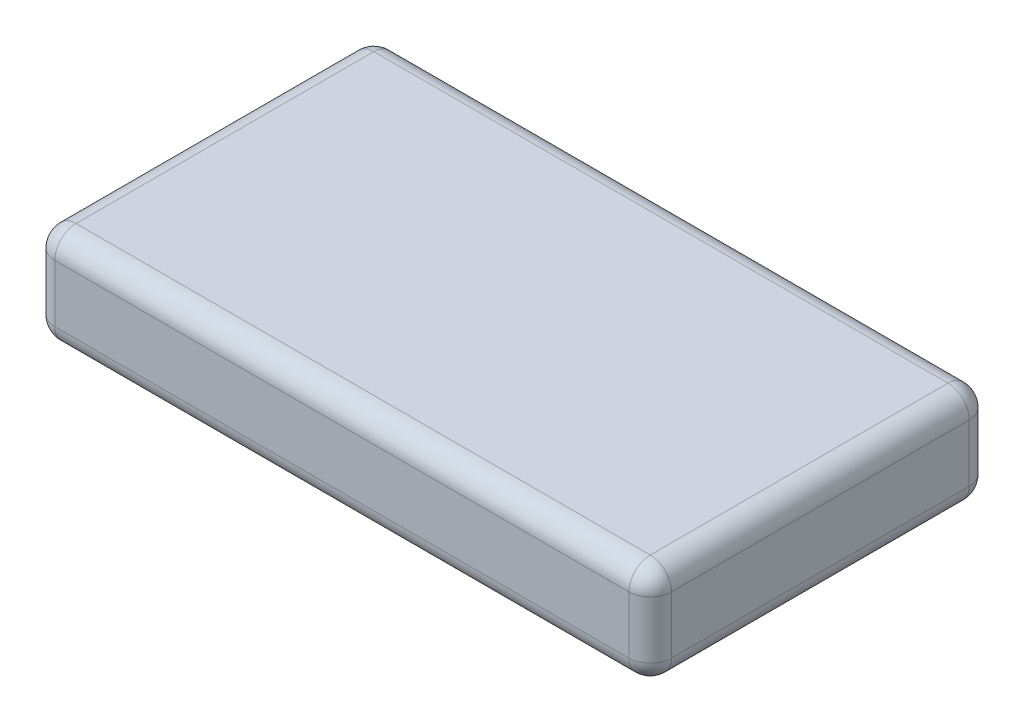
ISO-10303-21;
HEADER;
FILE_DESCRIPTION(('STEP AP214'),'2;1');
FILE_NAME('part.step','',(''),(''),'','','');
FILE_SCHEMA(('AUTOMOTIVE_DESIGN { 1 0 10303 214 1 1 1 1 }'));
ENDSEC;
DATA;
#1=APPLICATION_CONTEXT('core data for automotive mechanical design processes');
#2=APPLICATION_PROTOCOL_DEFINITION('international standard','automotive_design',2000,#1);
#3=PRODUCT_CONTEXT('',#1,'mechanical');
#4=PRODUCT('Part','Part','',(#3));
#5=PRODUCT_RELATED_PRODUCT_CATEGORY('part','',(#4));
#6=PRODUCT_DEFINITION_FORMATION('','',#4);
#7=PRODUCT_DEFINITION_CONTEXT('part definition',#1,'design');
#8=PRODUCT_DEFINITION('design','',#6,#7);
#9=PRODUCT_DEFINITION_SHAPE('','',#8);
#10=(LENGTH_UNIT() NAMED_UNIT(*) SI_UNIT(.MILLI.,.METRE.));
#11=(NAMED_UNIT(*) PLANE_ANGLE_UNIT() SI_UNIT($,.RADIAN.));
#12=(NAMED_UNIT(*) SI_UNIT($,.STERADIAN.) SOLID_ANGLE_UNIT());
#13=UNCERTAINTY_MEASURE_WITH_UNIT(LENGTH_MEASURE(1.E-05),#10,'distance_accuracy_value','');
#14=(GEOMETRIC_REPRESENTATION_CONTEXT(3) GLOBAL_UNCERTAINTY_ASSIGNED_CONTEXT((#13)) GLOBAL_UNIT_ASSIGNED_CONTEXT((#10,
#11,#12)) REPRESENTATION_CONTEXT('',''));
#15=CARTESIAN_POINT('',(0.,0.,0.));
#16=DIRECTION('',(0.,0.,1.));
#17=DIRECTION('',(1.,0.,0.));
#18=AXIS2_PLACEMENT_3D('',#15,#16,#17);
#19=CARTESIAN_POINT('',(29.,9.4,-16.));
#20=DIRECTION('',(-1.,0.,0.));
#21=DIRECTION('',(0.,0.,1.));
#22=AXIS2_PLACEMENT_3D('',#19,#20,#21);
#23=PLANE('',#22);
#24=DIRECTION('',(0.,0.,-1.));
#25=VECTOR('',#24,1.);
#26=CARTESIAN_POINT('',(29.,2.,-16.));
#27=LINE('',#26,#25);
#28=CARTESIAN_POINT('',(29.,2.,14.));
#29=VERTEX_POINT('',#28);
#30=CARTESIAN_POINT('',(29.,2.,-14.));
#31=VERTEX_POINT('',#30);
#32=EDGE_CURVE('E170',#29,#31,#27,.T.);
#33=ORIENTED_EDGE('',*,*,#32,.T.);
#34=DIRECTION('',(0.,-1.,0.));
#35=VECTOR('',#34,1.);
#36=CARTESIAN_POINT('',(29.,9.4,-14.));
#37=LINE('',#36,#35);
#38=CARTESIAN_POINT('',(29.,7.4,-14.));
#39=VERTEX_POINT('',#38);
#40=EDGE_CURVE('E172',#31,#39,#37,.F.);
#41=ORIENTED_EDGE('',*,*,#40,.T.);
#42=DIRECTION('',(0.,0.,-1.));
#43=VECTOR('',#42,1.);
#44=CARTESIAN_POINT('',(29.,7.4,16.));
#45=LINE('',#44,#43);
#46=CARTESIAN_POINT('',(29.,7.4,14.));
#47=VERTEX_POINT('',#46);
#48=EDGE_CURVE('E166',#39,#47,#45,.F.);
#49=ORIENTED_EDGE('',*,*,#48,.T.);
#50=DIRECTION('',(0.,-1.,0.));
#51=VECTOR('',#50,1.);
#52=CARTESIAN_POINT('',(29.,9.4,14.));
#53=LINE('',#52,#51);
#54=EDGE_CURVE('E168',#47,#29,#53,.T.);
#55=ORIENTED_EDGE('',*,*,#54,.T.);
#56=EDGE_LOOP('',(#33,#41,#49,#55));
#57=FACE_BOUND('',#56,.T.);
#58=ADVANCED_FACE('F35',(#57),#23,.F.);
#59=CARTESIAN_POINT('',(-29.,9.4,-16.));
#60=DIRECTION('',(0.,0.,1.));
#61=DIRECTION('',(1.,0.,0.));
#62=AXIS2_PLACEMENT_3D('',#59,#60,#61);
#63=PLANE('',#62);
#64=DIRECTION('',(0.,-1.,0.));
#65=VECTOR('',#64,1.);
#66=CARTESIAN_POINT('',(27.,9.4,-16.));
#67=LINE('',#66,#65);
#68=CARTESIAN_POINT('',(27.,7.4,-16.));
#69=VERTEX_POINT('',#68);
#70=CARTESIAN_POINT('',(27.,2.,-16.));
#71=VERTEX_POINT('',#70);
#72=EDGE_CURVE('E134',#69,#71,#67,.T.);
#73=ORIENTED_EDGE('',*,*,#72,.T.);
#74=DIRECTION('',(-1.,0.,0.));
#75=VECTOR('',#74,1.);
#76=CARTESIAN_POINT('',(-29.,2.,-16.));
#77=LINE('',#76,#75);
#78=CARTESIAN_POINT('',(-27.,2.,-16.));
#79=VERTEX_POINT('',#78);
#80=EDGE_CURVE('E130',#71,#79,#77,.T.);
#81=ORIENTED_EDGE('',*,*,#80,.T.);
#82=DIRECTION('',(0.,-1.,0.));
#83=VECTOR('',#82,1.);
#84=CARTESIAN_POINT('',(-27.,9.4,-16.));
#85=LINE('',#84,#83);
#86=CARTESIAN_POINT('',(-27.,7.4,-16.));
#87=VERTEX_POINT('',#86);
#88=EDGE_CURVE('E122',#79,#87,#85,.F.);
#89=ORIENTED_EDGE('',*,*,#88,.T.);
#90=DIRECTION('',(-1.,0.,0.));
#91=VECTOR('',#90,1.);
#92=CARTESIAN_POINT('',(29.,7.4,-16.));
#93=LINE('',#92,#91);
#94=EDGE_CURVE('E127',#87,#69,#93,.F.);
#95=ORIENTED_EDGE('',*,*,#94,.T.);
#96=EDGE_LOOP('',(#73,#81,#89,#95));
#97=FACE_BOUND('',#96,.T.);
#98=ADVANCED_FACE('F125',(#97),#63,.F.);
#99=CARTESIAN_POINT('',(-29.,9.4,-16.));
#100=DIRECTION('',(1.,0.,0.));
#101=DIRECTION('',(0.,0.,-1.));
#102=AXIS2_PLACEMENT_3D('',#99,#100,#101);
#103=PLANE('',#102);
#104=DIRECTION('',(0.,0.,1.));
#105=VECTOR('',#104,1.);
#106=CARTESIAN_POINT('',(-29.,7.4,-16.));
#107=LINE('',#106,#105);
#108=CARTESIAN_POINT('',(-29.,7.4,14.));
#109=VERTEX_POINT('',#108);
#110=CARTESIAN_POINT('',(-29.,7.4,-14.));
#111=VERTEX_POINT('',#110);
#112=EDGE_CURVE('E175',#109,#111,#107,.F.);
#113=ORIENTED_EDGE('',*,*,#112,.T.);
#114=DIRECTION('',(0.,-1.,0.));
#115=VECTOR('',#114,1.);
#116=CARTESIAN_POINT('',(-29.,9.4,-14.));
#117=LINE('',#116,#115);
#118=CARTESIAN_POINT('',(-29.,2.,-14.));
#119=VERTEX_POINT('',#118);
#120=EDGE_CURVE('E142',#111,#119,#117,.T.);
#121=ORIENTED_EDGE('',*,*,#120,.T.);
#122=DIRECTION('',(0.,0.,1.));
#123=VECTOR('',#122,1.);
#124=CARTESIAN_POINT('',(-29.,2.,-16.));
#125=LINE('',#124,#123);
#126=CARTESIAN_POINT('',(-29.,2.,14.));
#127=VERTEX_POINT('',#126);
#128=EDGE_CURVE('E179',#119,#127,#125,.T.);
#129=ORIENTED_EDGE('',*,*,#128,.T.);
#130=DIRECTION('',(0.,-1.,0.));
#131=VECTOR('',#130,1.);
#132=CARTESIAN_POINT('',(-29.,9.4,14.));
#133=LINE('',#132,#131);
#134=EDGE_CURVE('E177',#127,#109,#133,.F.);
#135=ORIENTED_EDGE('',*,*,#134,.T.);
#136=EDGE_LOOP('',(#113,#121,#129,#135));
#137=FACE_BOUND('',#136,.T.);
#138=ADVANCED_FACE('F326',(#137),#103,.F.);
#139=CARTESIAN_POINT('',(-29.,9.4,16.));
#140=DIRECTION('',(0.,0.,-1.));
#141=DIRECTION('',(-1.,0.,0.));
#142=AXIS2_PLACEMENT_3D('',#139,#140,#141);
#143=PLANE('',#142);
#144=DIRECTION('',(0.,-1.,0.));
#145=VECTOR('',#144,1.);
#146=CARTESIAN_POINT('',(-27.,9.4,16.));
#147=LINE('',#146,#145);
#148=CARTESIAN_POINT('',(-27.,7.4,16.));
#149=VERTEX_POINT('',#148);
#150=CARTESIAN_POINT('',(-27.,2.,16.));
#151=VERTEX_POINT('',#150);
#152=EDGE_CURVE('E195',#149,#151,#147,.T.);
#153=ORIENTED_EDGE('',*,*,#152,.T.);
#154=DIRECTION('',(1.,0.,0.));
#155=VECTOR('',#154,1.);
#156=CARTESIAN_POINT('',(-29.,2.,16.));
#157=LINE('',#156,#155);
#158=CARTESIAN_POINT('',(27.,2.,16.));
#159=VERTEX_POINT('',#158);
#160=EDGE_CURVE('E198',#151,#159,#157,.T.);
#161=ORIENTED_EDGE('',*,*,#160,.T.);
#162=DIRECTION('',(0.,-1.,0.));
#163=VECTOR('',#162,1.);
#164=CARTESIAN_POINT('',(27.,9.4,16.));
#165=LINE('',#164,#163);
#166=CARTESIAN_POINT('',(27.,7.4,16.));
#167=VERTEX_POINT('',#166);
#168=EDGE_CURVE('E193',#159,#167,#165,.F.);
#169=ORIENTED_EDGE('',*,*,#168,.T.);
#170=DIRECTION('',(1.,0.,0.));
#171=VECTOR('',#170,1.);
#172=CARTESIAN_POINT('',(-29.,7.4,16.));
#173=LINE('',#172,#171);
#174=EDGE_CURVE('E191',#167,#149,#173,.F.);
#175=ORIENTED_EDGE('',*,*,#174,.T.);
#176=EDGE_LOOP('',(#153,#161,#169,#175));
#177=FACE_BOUND('',#176,.T.);
#178=ADVANCED_FACE('F275',(#177),#143,.F.);
#179=CARTESIAN_POINT('',(0.,9.4,0.));
#180=DIRECTION('',(0.,1.,0.));
#181=DIRECTION('',(0.,0.,1.));
#182=AXIS2_PLACEMENT_3D('',#179,#180,#181);
#183=PLANE('',#182);
#184=DIRECTION('',(0.,0.,1.));
#185=VECTOR('',#184,1.);
#186=CARTESIAN_POINT('',(-27.,9.4,16.));
#187=LINE('',#186,#185);
#188=CARTESIAN_POINT('',(-27.,9.4,-14.));
#189=VERTEX_POINT('',#188);
#190=CARTESIAN_POINT('',(-27.,9.4,14.));
#191=VERTEX_POINT('',#190);
#192=EDGE_CURVE('E44',#189,#191,#187,.T.);
#193=ORIENTED_EDGE('',*,*,#192,.T.);
#194=DIRECTION('',(1.,0.,0.));
#195=VECTOR('',#194,1.);
#196=CARTESIAN_POINT('',(29.,9.4,14.));
#197=LINE('',#196,#195);
#198=CARTESIAN_POINT('',(27.,9.4,14.));
#199=VERTEX_POINT('',#198);
#200=EDGE_CURVE('E11',#191,#199,#197,.T.);
#201=ORIENTED_EDGE('',*,*,#200,.T.);
#202=DIRECTION('',(0.,0.,-1.));
#203=VECTOR('',#202,1.);
#204=CARTESIAN_POINT('',(27.,9.4,-16.));
#205=LINE('',#204,#203);
#206=CARTESIAN_POINT('',(27.,9.4,-14.));
#207=VERTEX_POINT('',#206);
#208=EDGE_CURVE('E200',#199,#207,#205,.T.);
#209=ORIENTED_EDGE('',*,*,#208,.T.);
#210=DIRECTION('',(-1.,0.,0.));
#211=VECTOR('',#210,1.);
#212=CARTESIAN_POINT('',(-29.,9.4,-14.));
#213=LINE('',#212,#211);
#214=EDGE_CURVE('E55',#207,#189,#213,.T.);
#215=ORIENTED_EDGE('',*,*,#214,.T.);
#216=EDGE_LOOP('',(#193,#201,#209,#215));
#217=FACE_BOUND('',#216,.T.);
#218=ADVANCED_FACE('F290',(#217),#183,.T.);
#219=CARTESIAN_POINT('',(0.,0.,0.));
#220=DIRECTION('',(0.,1.,0.));
#221=DIRECTION('',(0.,0.,1.));
#222=AXIS2_PLACEMENT_3D('',#219,#220,#221);
#223=PLANE('',#222);
#224=DIRECTION('',(0.,0.,1.));
#225=VECTOR('',#224,1.);
#226=CARTESIAN_POINT('',(-27.,0.,0.));
#227=LINE('',#226,#225);
#228=CARTESIAN_POINT('',(-27.,0.,14.));
#229=VERTEX_POINT('',#228);
#230=CARTESIAN_POINT('',(-27.,0.,-14.));
#231=VERTEX_POINT('',#230);
#232=EDGE_CURVE('E186',#229,#231,#227,.F.);
#233=ORIENTED_EDGE('',*,*,#232,.T.);
#234=DIRECTION('',(-1.,0.,0.));
#235=VECTOR('',#234,1.);
#236=CARTESIAN_POINT('',(0.,0.,-14.));
#237=LINE('',#236,#235);
#238=CARTESIAN_POINT('',(27.,0.,-14.));
#239=VERTEX_POINT('',#238);
#240=EDGE_CURVE('E188',#231,#239,#237,.F.);
#241=ORIENTED_EDGE('',*,*,#240,.T.);
#242=DIRECTION('',(0.,0.,-1.));
#243=VECTOR('',#242,1.);
#244=CARTESIAN_POINT('',(27.,0.,0.));
#245=LINE('',#244,#243);
#246=CARTESIAN_POINT('',(27.,0.,14.));
#247=VERTEX_POINT('',#246);
#248=EDGE_CURVE('E184',#239,#247,#245,.F.);
#249=ORIENTED_EDGE('',*,*,#248,.T.);
#250=DIRECTION('',(1.,0.,0.));
#251=VECTOR('',#250,1.);
#252=CARTESIAN_POINT('',(0.,0.,14.));
#253=LINE('',#252,#251);
#254=EDGE_CURVE('E182',#247,#229,#253,.F.);
#255=ORIENTED_EDGE('',*,*,#254,.T.);
#256=EDGE_LOOP('',(#233,#241,#249,#255));
#257=FACE_BOUND('',#256,.T.);
#258=ADVANCED_FACE('F266',(#257),#223,.F.);
#259=CARTESIAN_POINT('',(-27.,9.4,14.));
#260=DIRECTION('',(0.,-1.,0.));
#261=DIRECTION('',(0.,0.,-1.));
#262=AXIS2_PLACEMENT_3D('',#259,#260,#261);
#263=CYLINDRICAL_SURFACE('',#262,2.);
#264=CARTESIAN_POINT('',(-27.,7.4,14.));
#265=DIRECTION('',(0.,1.,0.));
#266=DIRECTION('',(0.,0.,1.));
#267=AXIS2_PLACEMENT_3D('',#264,#265,#266);
#268=CIRCLE('',#267,2.);
#269=EDGE_CURVE('E39',#109,#149,#268,.T.);
#270=ORIENTED_EDGE('',*,*,#269,.F.);
#271=ORIENTED_EDGE('',*,*,#134,.F.);
#272=CARTESIAN_POINT('',(-27.,2.,14.));
#273=DIRECTION('',(0.,-1.,0.));
#274=DIRECTION('',(0.,0.,-1.));
#275=AXIS2_PLACEMENT_3D('',#272,#273,#274);
#276=CIRCLE('',#275,2.);
#277=EDGE_CURVE('E162',#151,#127,#276,.T.);
#278=ORIENTED_EDGE('',*,*,#277,.F.);
#279=ORIENTED_EDGE('',*,*,#152,.F.);
#280=EDGE_LOOP('',(#270,#271,#278,#279));
#281=FACE_BOUND('',#280,.T.);
#282=ADVANCED_FACE('F37',(#281),#263,.T.);
#283=CARTESIAN_POINT('',(-27.,7.4,14.));
#284=DIRECTION('',(0.,0.,1.));
#285=DIRECTION('',(1.,0.,0.));
#286=AXIS2_PLACEMENT_3D('',#283,#284,#285);
#287=SPHERICAL_SURFACE('',#286,2.);
#288=CARTESIAN_POINT('',(-27.,7.4,14.));
#289=DIRECTION('',(0.,0.,1.));
#290=DIRECTION('',(1.,0.,0.));
#291=AXIS2_PLACEMENT_3D('',#288,#289,#290);
#292=CIRCLE('',#291,2.);
#293=EDGE_CURVE('E246',#109,#191,#292,.F.);
#294=ORIENTED_EDGE('',*,*,#293,.F.);
#295=ORIENTED_EDGE('',*,*,#269,.T.);
#296=CARTESIAN_POINT('',(-27.,7.4,14.));
#297=DIRECTION('',(-1.,0.,0.));
#298=DIRECTION('',(0.,0.,1.));
#299=AXIS2_PLACEMENT_3D('',#296,#297,#298);
#300=CIRCLE('',#299,2.);
#301=EDGE_CURVE('E248',#191,#149,#300,.F.);
#302=ORIENTED_EDGE('',*,*,#301,.F.);
#303=EDGE_LOOP('',(#294,#295,#302));
#304=FACE_BOUND('',#303,.T.);
#305=ADVANCED_FACE('F459',(#304),#287,.T.);
#306=CARTESIAN_POINT('',(-27.,2.,14.));
#307=DIRECTION('',(0.,0.,1.));
#308=DIRECTION('',(1.,0.,0.));
#309=AXIS2_PLACEMENT_3D('',#306,#307,#308);
#310=SPHERICAL_SURFACE('',#309,2.);
#311=CARTESIAN_POINT('',(-27.,2.,14.));
#312=DIRECTION('',(-1.,0.,0.));
#313=DIRECTION('',(0.,0.,1.));
#314=AXIS2_PLACEMENT_3D('',#311,#312,#313);
#315=CIRCLE('',#314,2.);
#316=EDGE_CURVE('E240',#151,#229,#315,.F.);
#317=ORIENTED_EDGE('',*,*,#316,.F.);
#318=ORIENTED_EDGE('',*,*,#277,.T.);
#319=CARTESIAN_POINT('',(-27.,2.,14.));
#320=DIRECTION('',(0.,0.,1.));
#321=DIRECTION('',(1.,0.,0.));
#322=AXIS2_PLACEMENT_3D('',#319,#320,#321);
#323=CIRCLE('',#322,2.);
#324=EDGE_CURVE('E243',#229,#127,#323,.F.);
#325=ORIENTED_EDGE('',*,*,#324,.F.);
#326=EDGE_LOOP('',(#317,#318,#325));
#327=FACE_BOUND('',#326,.T.);
#328=ADVANCED_FACE('F255',(#327),#310,.T.);
#329=CARTESIAN_POINT('',(0.,7.4,14.));
#330=DIRECTION('',(-1.,0.,0.));
#331=DIRECTION('',(0.,0.,1.));
#332=AXIS2_PLACEMENT_3D('',#329,#330,#331);
#333=CYLINDRICAL_SURFACE('',#332,2.);
#334=ORIENTED_EDGE('',*,*,#301,.T.);
#335=ORIENTED_EDGE('',*,*,#174,.F.);
#336=CARTESIAN_POINT('',(27.,7.4,14.));
#337=DIRECTION('',(1.,0.,0.));
#338=DIRECTION('',(0.,0.,-1.));
#339=AXIS2_PLACEMENT_3D('',#336,#337,#338);
#340=CIRCLE('',#339,2.);
#341=EDGE_CURVE('E234',#199,#167,#340,.T.);
#342=ORIENTED_EDGE('',*,*,#341,.F.);
#343=ORIENTED_EDGE('',*,*,#200,.F.);
#344=EDGE_LOOP('',(#334,#335,#342,#343));
#345=FACE_BOUND('',#344,.T.);
#346=ADVANCED_FACE('F289',(#345),#333,.T.);
#347=CARTESIAN_POINT('',(-27.,7.4,0.));
#348=DIRECTION('',(0.,0.,-1.));
#349=DIRECTION('',(-1.,0.,0.));
#350=AXIS2_PLACEMENT_3D('',#347,#348,#349);
#351=CYLINDRICAL_SURFACE('',#350,2.);
#352=ORIENTED_EDGE('',*,*,#293,.T.);
#353=ORIENTED_EDGE('',*,*,#192,.F.);
#354=CARTESIAN_POINT('',(-27.,7.4,-14.));
#355=DIRECTION('',(0.,0.,-1.));
#356=DIRECTION('',(-1.,0.,0.));
#357=AXIS2_PLACEMENT_3D('',#354,#355,#356);
#358=CIRCLE('',#357,2.);
#359=EDGE_CURVE('E146',#111,#189,#358,.T.);
#360=ORIENTED_EDGE('',*,*,#359,.F.);
#361=ORIENTED_EDGE('',*,*,#112,.F.);
#362=EDGE_LOOP('',(#352,#353,#360,#361));
#363=FACE_BOUND('',#362,.T.);
#364=ADVANCED_FACE('F436',(#363),#351,.T.);
#365=CARTESIAN_POINT('',(-27.,9.4,-14.));
#366=DIRECTION('',(0.,-1.,0.));
#367=DIRECTION('',(0.,0.,-1.));
#368=AXIS2_PLACEMENT_3D('',#365,#366,#367);
#369=CYLINDRICAL_SURFACE('',#368,2.);
#370=CARTESIAN_POINT('',(-27.,2.,-14.));
#371=DIRECTION('',(0.,-1.,0.));
#372=DIRECTION('',(0.,0.,-1.));
#373=AXIS2_PLACEMENT_3D('',#370,#371,#372);
#374=CIRCLE('',#373,2.);
#375=EDGE_CURVE('E147',#119,#79,#374,.T.);
#376=ORIENTED_EDGE('',*,*,#375,.F.);
#377=ORIENTED_EDGE('',*,*,#120,.F.);
#378=CARTESIAN_POINT('',(-27.,7.4,-14.));
#379=DIRECTION('',(0.,1.,0.));
#380=DIRECTION('',(0.,0.,1.));
#381=AXIS2_PLACEMENT_3D('',#378,#379,#380);
#382=CIRCLE('',#381,2.);
#383=EDGE_CURVE('E138',#87,#111,#382,.T.);
#384=ORIENTED_EDGE('',*,*,#383,.F.);
#385=ORIENTED_EDGE('',*,*,#88,.F.);
#386=EDGE_LOOP('',(#376,#377,#384,#385));
#387=FACE_BOUND('',#386,.T.);
#388=ADVANCED_FACE('F140',(#387),#369,.T.);
#389=CARTESIAN_POINT('',(-27.,2.,-16.));
#390=DIRECTION('',(0.,0.,1.));
#391=DIRECTION('',(1.,0.,0.));
#392=AXIS2_PLACEMENT_3D('',#389,#390,#391);
#393=CYLINDRICAL_SURFACE('',#392,2.);
#394=ORIENTED_EDGE('',*,*,#324,.T.);
#395=ORIENTED_EDGE('',*,*,#128,.F.);
#396=CARTESIAN_POINT('',(-27.,2.,-14.));
#397=DIRECTION('',(0.,0.,-1.));
#398=DIRECTION('',(-1.,0.,0.));
#399=AXIS2_PLACEMENT_3D('',#396,#397,#398);
#400=CIRCLE('',#399,2.);
#401=EDGE_CURVE('E230',#231,#119,#400,.T.);
#402=ORIENTED_EDGE('',*,*,#401,.F.);
#403=ORIENTED_EDGE('',*,*,#232,.F.);
#404=EDGE_LOOP('',(#394,#395,#402,#403));
#405=FACE_BOUND('',#404,.T.);
#406=ADVANCED_FACE('F262',(#405),#393,.T.);
#407=CARTESIAN_POINT('',(-29.,2.,14.));
#408=DIRECTION('',(1.,0.,0.));
#409=DIRECTION('',(0.,0.,-1.));
#410=AXIS2_PLACEMENT_3D('',#407,#408,#409);
#411=CYLINDRICAL_SURFACE('',#410,2.);
#412=ORIENTED_EDGE('',*,*,#316,.T.);
#413=ORIENTED_EDGE('',*,*,#254,.F.);
#414=CARTESIAN_POINT('',(27.,2.,14.));
#415=DIRECTION('',(1.,0.,0.));
#416=DIRECTION('',(0.,0.,-1.));
#417=AXIS2_PLACEMENT_3D('',#414,#415,#416);
#418=CIRCLE('',#417,2.);
#419=EDGE_CURVE('E227',#159,#247,#418,.T.);
#420=ORIENTED_EDGE('',*,*,#419,.F.);
#421=ORIENTED_EDGE('',*,*,#160,.F.);
#422=EDGE_LOOP('',(#412,#413,#420,#421));
#423=FACE_BOUND('',#422,.T.);
#424=ADVANCED_FACE('F272',(#423),#411,.T.);
#425=CARTESIAN_POINT('',(27.,9.4,14.));
#426=DIRECTION('',(0.,-1.,0.));
#427=DIRECTION('',(0.,0.,-1.));
#428=AXIS2_PLACEMENT_3D('',#425,#426,#427);
#429=CYLINDRICAL_SURFACE('',#428,2.);
#430=CARTESIAN_POINT('',(27.,7.4,14.));
#431=DIRECTION('',(0.,1.,0.));
#432=DIRECTION('',(0.,0.,1.));
#433=AXIS2_PLACEMENT_3D('',#430,#431,#432);
#434=CIRCLE('',#433,2.);
#435=EDGE_CURVE('E237',#167,#47,#434,.T.);
#436=ORIENTED_EDGE('',*,*,#435,.F.);
#437=ORIENTED_EDGE('',*,*,#168,.F.);
#438=CARTESIAN_POINT('',(27.,2.,14.));
#439=DIRECTION('',(0.,-1.,0.));
#440=DIRECTION('',(0.,0.,-1.));
#441=AXIS2_PLACEMENT_3D('',#438,#439,#440);
#442=CIRCLE('',#441,2.);
#443=EDGE_CURVE('E224',#29,#159,#442,.T.);
#444=ORIENTED_EDGE('',*,*,#443,.F.);
#445=ORIENTED_EDGE('',*,*,#54,.F.);
#446=EDGE_LOOP('',(#436,#437,#444,#445));
#447=FACE_BOUND('',#446,.T.);
#448=ADVANCED_FACE('F280',(#447),#429,.T.);
#449=CARTESIAN_POINT('',(27.,7.4,14.));
#450=DIRECTION('',(0.,0.,1.));
#451=DIRECTION('',(1.,0.,0.));
#452=AXIS2_PLACEMENT_3D('',#449,#450,#451);
#453=SPHERICAL_SURFACE('',#452,2.);
#454=ORIENTED_EDGE('',*,*,#341,.T.);
#455=ORIENTED_EDGE('',*,*,#435,.T.);
#456=CARTESIAN_POINT('',(27.,7.4,14.));
#457=DIRECTION('',(0.,0.,1.));
#458=DIRECTION('',(0.,-1.,0.));
#459=AXIS2_PLACEMENT_3D('',#456,#457,#458);
#460=CIRCLE('',#459,2.);
#461=EDGE_CURVE('E153',#199,#47,#460,.F.);
#462=ORIENTED_EDGE('',*,*,#461,.F.);
#463=EDGE_LOOP('',(#454,#455,#462));
#464=FACE_BOUND('',#463,.T.);
#465=ADVANCED_FACE('F286',(#464),#453,.T.);
#466=CARTESIAN_POINT('',(-27.,7.4,-14.));
#467=DIRECTION('',(0.,0.,1.));
#468=DIRECTION('',(1.,0.,0.));
#469=AXIS2_PLACEMENT_3D('',#466,#467,#468);
#470=SPHERICAL_SURFACE('',#469,2.);
#471=ORIENTED_EDGE('',*,*,#383,.T.);
#472=ORIENTED_EDGE('',*,*,#359,.T.);
#473=CARTESIAN_POINT('',(-27.,7.4,-14.));
#474=DIRECTION('',(-1.,0.,0.));
#475=DIRECTION('',(0.,0.,1.));
#476=AXIS2_PLACEMENT_3D('',#473,#474,#475);
#477=CIRCLE('',#476,2.);
#478=EDGE_CURVE('E150',#87,#189,#477,.F.);
#479=ORIENTED_EDGE('',*,*,#478,.F.);
#480=EDGE_LOOP('',(#471,#472,#479));
#481=FACE_BOUND('',#480,.T.);
#482=ADVANCED_FACE('F151',(#481),#470,.T.);
#483=CARTESIAN_POINT('',(-27.,2.,-14.));
#484=DIRECTION('',(0.,0.,1.));
#485=DIRECTION('',(1.,0.,0.));
#486=AXIS2_PLACEMENT_3D('',#483,#484,#485);
#487=SPHERICAL_SURFACE('',#486,2.);
#488=ORIENTED_EDGE('',*,*,#401,.T.);
#489=ORIENTED_EDGE('',*,*,#375,.T.);
#490=CARTESIAN_POINT('',(-27.,2.,-14.));
#491=DIRECTION('',(-1.,0.,0.));
#492=DIRECTION('',(0.,0.,1.));
#493=AXIS2_PLACEMENT_3D('',#490,#491,#492);
#494=CIRCLE('',#493,2.);
#495=EDGE_CURVE('E154',#231,#79,#494,.F.);
#496=ORIENTED_EDGE('',*,*,#495,.F.);
#497=EDGE_LOOP('',(#488,#489,#496));
#498=FACE_BOUND('',#497,.T.);
#499=ADVANCED_FACE('F309',(#498),#487,.T.);
#500=CARTESIAN_POINT('',(27.,2.,14.));
#501=DIRECTION('',(0.,0.,1.));
#502=DIRECTION('',(1.,0.,0.));
#503=AXIS2_PLACEMENT_3D('',#500,#501,#502);
#504=SPHERICAL_SURFACE('',#503,2.);
#505=ORIENTED_EDGE('',*,*,#443,.T.);
#506=ORIENTED_EDGE('',*,*,#419,.T.);
#507=CARTESIAN_POINT('',(27.,2.,14.));
#508=DIRECTION('',(0.,0.,1.));
#509=DIRECTION('',(1.,0.,0.));
#510=AXIS2_PLACEMENT_3D('',#507,#508,#509);
#511=CIRCLE('',#510,2.);
#512=EDGE_CURVE('E217',#29,#247,#511,.F.);
#513=ORIENTED_EDGE('',*,*,#512,.F.);
#514=EDGE_LOOP('',(#505,#506,#513));
#515=FACE_BOUND('',#514,.T.);
#516=ADVANCED_FACE('F311',(#515),#504,.T.);
#517=CARTESIAN_POINT('',(27.,7.4,0.));
#518=DIRECTION('',(0.,0.,1.));
#519=DIRECTION('',(1.,0.,0.));
#520=AXIS2_PLACEMENT_3D('',#517,#518,#519);
#521=CYLINDRICAL_SURFACE('',#520,2.);
#522=ORIENTED_EDGE('',*,*,#461,.T.);
#523=ORIENTED_EDGE('',*,*,#48,.F.);
#524=CARTESIAN_POINT('',(27.,7.4,-14.));
#525=DIRECTION('',(0.,0.,-1.));
#526=DIRECTION('',(-1.,0.,0.));
#527=AXIS2_PLACEMENT_3D('',#524,#525,#526);
#528=CIRCLE('',#527,2.);
#529=EDGE_CURVE('E214',#207,#39,#528,.T.);
#530=ORIENTED_EDGE('',*,*,#529,.F.);
#531=ORIENTED_EDGE('',*,*,#208,.F.);
#532=EDGE_LOOP('',(#522,#523,#530,#531));
#533=FACE_BOUND('',#532,.T.);
#534=ADVANCED_FACE('F294',(#533),#521,.T.);
#535=CARTESIAN_POINT('',(0.,7.4,-14.));
#536=DIRECTION('',(1.,0.,0.));
#537=DIRECTION('',(0.,0.,-1.));
#538=AXIS2_PLACEMENT_3D('',#535,#536,#537);
#539=CYLINDRICAL_SURFACE('',#538,2.);
#540=ORIENTED_EDGE('',*,*,#478,.T.);
#541=ORIENTED_EDGE('',*,*,#214,.F.);
#542=CARTESIAN_POINT('',(27.,7.4,-14.));
#543=DIRECTION('',(1.,0.,0.));
#544=DIRECTION('',(0.,1.,0.));
#545=AXIS2_PLACEMENT_3D('',#542,#543,#544);
#546=CIRCLE('',#545,2.);
#547=EDGE_CURVE('E158',#69,#207,#546,.T.);
#548=ORIENTED_EDGE('',*,*,#547,.F.);
#549=ORIENTED_EDGE('',*,*,#94,.F.);
#550=EDGE_LOOP('',(#540,#541,#548,#549));
#551=FACE_BOUND('',#550,.T.);
#552=ADVANCED_FACE('F156',(#551),#539,.T.);
#553=CARTESIAN_POINT('',(-29.,2.,-14.));
#554=DIRECTION('',(-1.,0.,0.));
#555=DIRECTION('',(0.,0.,1.));
#556=AXIS2_PLACEMENT_3D('',#553,#554,#555);
#557=CYLINDRICAL_SURFACE('',#556,2.);
#558=ORIENTED_EDGE('',*,*,#495,.T.);
#559=ORIENTED_EDGE('',*,*,#80,.F.);
#560=CARTESIAN_POINT('',(27.,2.,-14.));
#561=DIRECTION('',(1.,0.,0.));
#562=DIRECTION('',(0.,0.,-1.));
#563=AXIS2_PLACEMENT_3D('',#560,#561,#562);
#564=CIRCLE('',#563,2.);
#565=EDGE_CURVE('E210',#239,#71,#564,.T.);
#566=ORIENTED_EDGE('',*,*,#565,.F.);
#567=ORIENTED_EDGE('',*,*,#240,.F.);
#568=EDGE_LOOP('',(#558,#559,#566,#567));
#569=FACE_BOUND('',#568,.T.);
#570=ADVANCED_FACE('F307',(#569),#557,.T.);
#571=CARTESIAN_POINT('',(27.,2.,-16.));
#572=DIRECTION('',(0.,0.,-1.));
#573=DIRECTION('',(-1.,0.,0.));
#574=AXIS2_PLACEMENT_3D('',#571,#572,#573);
#575=CYLINDRICAL_SURFACE('',#574,2.);
#576=ORIENTED_EDGE('',*,*,#512,.T.);
#577=ORIENTED_EDGE('',*,*,#248,.F.);
#578=CARTESIAN_POINT('',(27.,2.,-14.));
#579=DIRECTION('',(0.,0.,-1.));
#580=DIRECTION('',(-1.,0.,0.));
#581=AXIS2_PLACEMENT_3D('',#578,#579,#580);
#582=CIRCLE('',#581,2.);
#583=EDGE_CURVE('E208',#31,#239,#582,.T.);
#584=ORIENTED_EDGE('',*,*,#583,.F.);
#585=ORIENTED_EDGE('',*,*,#32,.F.);
#586=EDGE_LOOP('',(#576,#577,#584,#585));
#587=FACE_BOUND('',#586,.T.);
#588=ADVANCED_FACE('F336',(#587),#575,.T.);
#589=CARTESIAN_POINT('',(27.,7.4,-14.));
#590=DIRECTION('',(0.,0.,1.));
#591=DIRECTION('',(1.,0.,0.));
#592=AXIS2_PLACEMENT_3D('',#589,#590,#591);
#593=SPHERICAL_SURFACE('',#592,2.);
#594=ORIENTED_EDGE('',*,*,#547,.T.);
#595=ORIENTED_EDGE('',*,*,#529,.T.);
#596=CARTESIAN_POINT('',(27.,7.4,-14.));
#597=DIRECTION('',(0.,1.,0.));
#598=DIRECTION('',(0.,0.,1.));
#599=AXIS2_PLACEMENT_3D('',#596,#597,#598);
#600=CIRCLE('',#599,2.);
#601=EDGE_CURVE('E206',#69,#39,#600,.F.);
#602=ORIENTED_EDGE('',*,*,#601,.F.);
#603=EDGE_LOOP('',(#594,#595,#602));
#604=FACE_BOUND('',#603,.T.);
#605=ADVANCED_FACE('F296',(#604),#593,.T.);
#606=CARTESIAN_POINT('',(27.,2.,-14.));
#607=DIRECTION('',(0.,0.,1.));
#608=DIRECTION('',(1.,0.,0.));
#609=AXIS2_PLACEMENT_3D('',#606,#607,#608);
#610=SPHERICAL_SURFACE('',#609,2.);
#611=ORIENTED_EDGE('',*,*,#583,.T.);
#612=ORIENTED_EDGE('',*,*,#565,.T.);
#613=CARTESIAN_POINT('',(27.,2.,-14.));
#614=DIRECTION('',(0.,-1.,0.));
#615=DIRECTION('',(0.,0.,-1.));
#616=AXIS2_PLACEMENT_3D('',#613,#614,#615);
#617=CIRCLE('',#616,2.);
#618=EDGE_CURVE('E204',#31,#71,#617,.F.);
#619=ORIENTED_EDGE('',*,*,#618,.F.);
#620=EDGE_LOOP('',(#611,#612,#619));
#621=FACE_BOUND('',#620,.T.);
#622=ADVANCED_FACE('F304',(#621),#610,.T.);
#623=CARTESIAN_POINT('',(27.,9.4,-14.));
#624=DIRECTION('',(0.,-1.,0.));
#625=DIRECTION('',(0.,0.,-1.));
#626=AXIS2_PLACEMENT_3D('',#623,#624,#625);
#627=CYLINDRICAL_SURFACE('',#626,2.);
#628=ORIENTED_EDGE('',*,*,#601,.T.);
#629=ORIENTED_EDGE('',*,*,#40,.F.);
#630=ORIENTED_EDGE('',*,*,#618,.T.);
#631=ORIENTED_EDGE('',*,*,#72,.F.);
#632=EDGE_LOOP('',(#628,#629,#630,#631));
#633=FACE_BOUND('',#632,.T.);
#634=ADVANCED_FACE('F300',(#633),#627,.T.);
#635=CLOSED_SHELL('',(#58,#98,#138,#178,#218,#258,#282,#305,#328,#346,#364,#388,#406,#424,#448,
#465,#482,#499,#516,#534,#552,#570,#588,#605,#622,#634));
#636=MANIFOLD_SOLID_BREP('B2',#635);
#637=ADVANCED_BREP_SHAPE_REPRESENTATION('',(#18,#636),#14);
#638=SHAPE_DEFINITION_REPRESENTATION(#9,#637);
ENDSEC;
END-ISO-10303-21;
